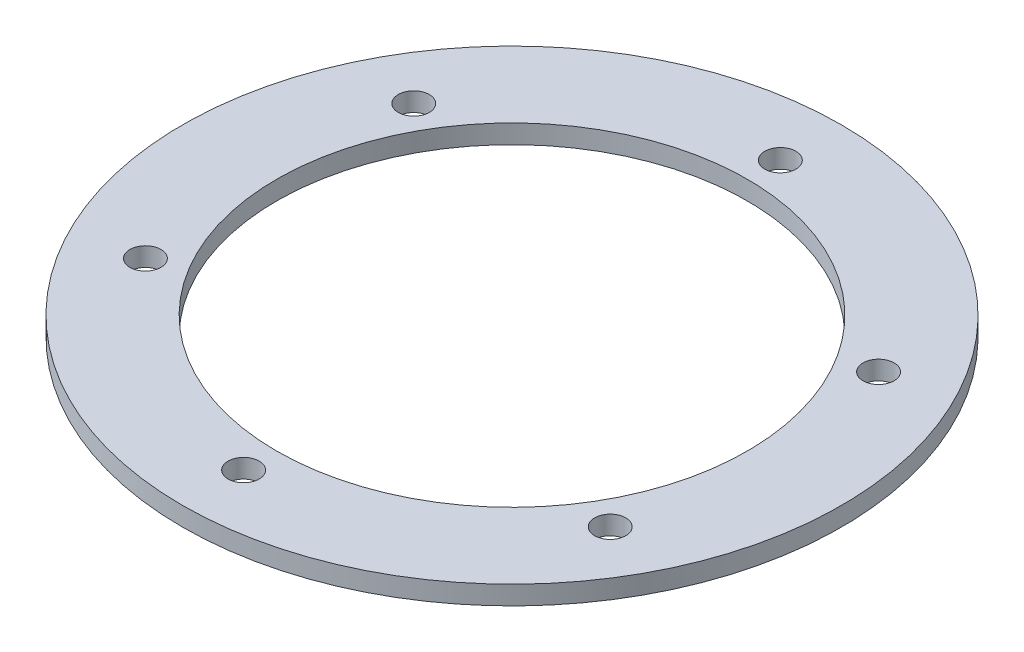
ISO-10303-21;
HEADER;
FILE_DESCRIPTION(('STEP AP214'),'2;1');
FILE_NAME('part.step','',(''),(''),'','','');
FILE_SCHEMA(('AUTOMOTIVE_DESIGN { 1 0 10303 214 1 1 1 1 }'));
ENDSEC;
DATA;
#1=APPLICATION_CONTEXT('core data for automotive mechanical design processes');
#2=APPLICATION_PROTOCOL_DEFINITION('international standard','automotive_design',2000,#1);
#3=PRODUCT_CONTEXT('',#1,'mechanical');
#4=PRODUCT('Part','Part','',(#3));
#5=PRODUCT_RELATED_PRODUCT_CATEGORY('part','',(#4));
#6=PRODUCT_DEFINITION_FORMATION('','',#4);
#7=PRODUCT_DEFINITION_CONTEXT('part definition',#1,'design');
#8=PRODUCT_DEFINITION('design','',#6,#7);
#9=PRODUCT_DEFINITION_SHAPE('','',#8);
#10=(LENGTH_UNIT() NAMED_UNIT(*) SI_UNIT(.MILLI.,.METRE.));
#11=(NAMED_UNIT(*) PLANE_ANGLE_UNIT() SI_UNIT($,.RADIAN.));
#12=(NAMED_UNIT(*) SI_UNIT($,.STERADIAN.) SOLID_ANGLE_UNIT());
#13=UNCERTAINTY_MEASURE_WITH_UNIT(LENGTH_MEASURE(1.E-05),#10,'distance_accuracy_value','');
#14=(GEOMETRIC_REPRESENTATION_CONTEXT(3) GLOBAL_UNCERTAINTY_ASSIGNED_CONTEXT((#13)) GLOBAL_UNIT_ASSIGNED_CONTEXT((#10,
#11,#12)) REPRESENTATION_CONTEXT('',''));
#15=CARTESIAN_POINT('',(0.,0.,0.));
#16=DIRECTION('',(0.,0.,1.));
#17=DIRECTION('',(1.,0.,0.));
#18=AXIS2_PLACEMENT_3D('',#15,#16,#17);
#19=CARTESIAN_POINT('',(0.,2.,0.));
#20=DIRECTION('',(0.,-1.,0.));
#21=DIRECTION('',(0.,0.,-1.));
#22=AXIS2_PLACEMENT_3D('',#19,#20,#21);
#23=CYLINDRICAL_SURFACE('',#22,35.);
#24=CARTESIAN_POINT('',(0.,2.,0.));
#25=DIRECTION('',(0.,1.,0.));
#26=DIRECTION('',(0.,0.,1.));
#27=AXIS2_PLACEMENT_3D('',#24,#25,#26);
#28=CIRCLE('',#27,35.);
#29=CARTESIAN_POINT('',(0.,2.,35.));
#30=VERTEX_POINT('',#29);
#31=EDGE_CURVE('E10',#30,#30,#28,.T.);
#32=ORIENTED_EDGE('',*,*,#31,.F.);
#33=EDGE_LOOP('',(#32));
#34=FACE_BOUND('',#33,.T.);
#35=CARTESIAN_POINT('',(0.,0.,0.));
#36=DIRECTION('',(0.,1.,0.));
#37=DIRECTION('',(0.,0.,1.));
#38=AXIS2_PLACEMENT_3D('',#35,#36,#37);
#39=CIRCLE('',#38,35.);
#40=CARTESIAN_POINT('',(0.,0.,35.));
#41=VERTEX_POINT('',#40);
#42=EDGE_CURVE('E40',#41,#41,#39,.T.);
#43=ORIENTED_EDGE('',*,*,#42,.T.);
#44=EDGE_LOOP('',(#43));
#45=FACE_BOUND('',#44,.T.);
#46=ADVANCED_FACE('F37',(#34,#45),#23,.T.);
#47=CARTESIAN_POINT('',(0.,2.,0.));
#48=DIRECTION('',(0.,1.,0.));
#49=DIRECTION('',(0.,0.,1.));
#50=AXIS2_PLACEMENT_3D('',#47,#48,#49);
#51=PLANE('',#50);
#52=CARTESIAN_POINT('',(24.6817240078563,2.,-14.2500000000003));
#53=DIRECTION('',(0.,1.,0.));
#54=DIRECTION('',(0.,0.,1.));
#55=AXIS2_PLACEMENT_3D('',#52,#53,#54);
#56=CIRCLE('',#55,1.65000000000001);
#57=CARTESIAN_POINT('',(24.6817240078563,2.,-12.6000000000003));
#58=VERTEX_POINT('',#57);
#59=EDGE_CURVE('E87',#58,#58,#56,.T.);
#60=ORIENTED_EDGE('',*,*,#59,.F.);
#61=EDGE_LOOP('',(#60));
#62=FACE_BOUND('',#61,.T.);
#63=CARTESIAN_POINT('',(24.6817240078566,2.,14.2499999999998));
#64=DIRECTION('',(0.,1.,0.));
#65=DIRECTION('',(0.,0.,1.));
#66=AXIS2_PLACEMENT_3D('',#63,#64,#65);
#67=CIRCLE('',#66,1.65000000000001);
#68=CARTESIAN_POINT('',(24.6817240078566,2.,15.8999999999998));
#69=VERTEX_POINT('',#68);
#70=EDGE_CURVE('E81',#69,#69,#67,.T.);
#71=ORIENTED_EDGE('',*,*,#70,.F.);
#72=EDGE_LOOP('',(#71));
#73=FACE_BOUND('',#72,.T.);
#74=CARTESIAN_POINT('',(0.,2.,28.5));
#75=DIRECTION('',(0.,1.,0.));
#76=DIRECTION('',(0.,0.,1.));
#77=AXIS2_PLACEMENT_3D('',#74,#75,#76);
#78=CIRCLE('',#77,1.65000000000001);
#79=CARTESIAN_POINT('',(0.,2.,30.15));
#80=VERTEX_POINT('',#79);
#81=EDGE_CURVE('E75',#80,#80,#78,.T.);
#82=ORIENTED_EDGE('',*,*,#81,.F.);
#83=EDGE_LOOP('',(#82));
#84=FACE_BOUND('',#83,.T.);
#85=CARTESIAN_POINT('',(-24.6817240078564,2.,14.2500000000001));
#86=DIRECTION('',(0.,1.,0.));
#87=DIRECTION('',(0.,0.,1.));
#88=AXIS2_PLACEMENT_3D('',#85,#86,#87);
#89=CIRCLE('',#88,1.65000000000001);
#90=CARTESIAN_POINT('',(-24.6817240078564,2.,15.9000000000001));
#91=VERTEX_POINT('',#90);
#92=EDGE_CURVE('E69',#91,#91,#89,.T.);
#93=ORIENTED_EDGE('',*,*,#92,.F.);
#94=EDGE_LOOP('',(#93));
#95=FACE_BOUND('',#94,.T.);
#96=CARTESIAN_POINT('',(-24.6817240078565,2.,-14.2499999999999));
#97=DIRECTION('',(0.,1.,0.));
#98=DIRECTION('',(0.,0.,1.));
#99=AXIS2_PLACEMENT_3D('',#96,#97,#98);
#100=CIRCLE('',#99,1.65000000000001);
#101=CARTESIAN_POINT('',(-24.6817240078565,2.,-12.5999999999999));
#102=VERTEX_POINT('',#101);
#103=EDGE_CURVE('E63',#102,#102,#100,.T.);
#104=ORIENTED_EDGE('',*,*,#103,.F.);
#105=EDGE_LOOP('',(#104));
#106=FACE_BOUND('',#105,.T.);
#107=CARTESIAN_POINT('',(0.,2.,-28.5));
#108=DIRECTION('',(0.,1.,0.));
#109=DIRECTION('',(0.,0.,1.));
#110=AXIS2_PLACEMENT_3D('',#107,#108,#109);
#111=CIRCLE('',#110,1.65000000000001);
#112=CARTESIAN_POINT('',(0.,2.,-26.85));
#113=VERTEX_POINT('',#112);
#114=EDGE_CURVE('E57',#113,#113,#111,.T.);
#115=ORIENTED_EDGE('',*,*,#114,.F.);
#116=EDGE_LOOP('',(#115));
#117=FACE_BOUND('',#116,.T.);
#118=CARTESIAN_POINT('',(0.,2.,0.));
#119=DIRECTION('',(0.,1.,0.));
#120=DIRECTION('',(0.,0.,1.));
#121=AXIS2_PLACEMENT_3D('',#118,#119,#120);
#122=CIRCLE('',#121,25.);
#123=CARTESIAN_POINT('',(0.,2.,25.));
#124=VERTEX_POINT('',#123);
#125=EDGE_CURVE('E49',#124,#124,#122,.T.);
#126=ORIENTED_EDGE('',*,*,#125,.F.);
#127=EDGE_LOOP('',(#126));
#128=FACE_BOUND('',#127,.T.);
#129=ORIENTED_EDGE('',*,*,#31,.T.);
#130=EDGE_LOOP('',(#129));
#131=FACE_BOUND('',#130,.T.);
#132=ADVANCED_FACE('F93',(#62,#73,#84,#95,#106,#117,#128,#131),#51,.T.);
#133=CARTESIAN_POINT('',(0.,0.,0.));
#134=DIRECTION('',(0.,1.,0.));
#135=DIRECTION('',(0.,0.,1.));
#136=AXIS2_PLACEMENT_3D('',#133,#134,#135);
#137=PLANE('',#136);
#138=CARTESIAN_POINT('',(24.6817240078563,0.,-14.2500000000003));
#139=DIRECTION('',(0.,1.,0.));
#140=DIRECTION('',(0.,0.,1.));
#141=AXIS2_PLACEMENT_3D('',#138,#139,#140);
#142=CIRCLE('',#141,1.65000000000001);
#143=CARTESIAN_POINT('',(24.6817240078563,0.,-12.6000000000003));
#144=VERTEX_POINT('',#143);
#145=EDGE_CURVE('E84',#144,#144,#142,.T.);
#146=ORIENTED_EDGE('',*,*,#145,.T.);
#147=EDGE_LOOP('',(#146));
#148=FACE_BOUND('',#147,.T.);
#149=CARTESIAN_POINT('',(24.6817240078566,0.,14.2499999999998));
#150=DIRECTION('',(0.,1.,0.));
#151=DIRECTION('',(0.,0.,1.));
#152=AXIS2_PLACEMENT_3D('',#149,#150,#151);
#153=CIRCLE('',#152,1.65000000000001);
#154=CARTESIAN_POINT('',(24.6817240078566,0.,15.8999999999998));
#155=VERTEX_POINT('',#154);
#156=EDGE_CURVE('E78',#155,#155,#153,.T.);
#157=ORIENTED_EDGE('',*,*,#156,.T.);
#158=EDGE_LOOP('',(#157));
#159=FACE_BOUND('',#158,.T.);
#160=CARTESIAN_POINT('',(0.,0.,28.5));
#161=DIRECTION('',(0.,1.,0.));
#162=DIRECTION('',(0.,0.,1.));
#163=AXIS2_PLACEMENT_3D('',#160,#161,#162);
#164=CIRCLE('',#163,1.65000000000001);
#165=CARTESIAN_POINT('',(0.,0.,30.15));
#166=VERTEX_POINT('',#165);
#167=EDGE_CURVE('E72',#166,#166,#164,.T.);
#168=ORIENTED_EDGE('',*,*,#167,.T.);
#169=EDGE_LOOP('',(#168));
#170=FACE_BOUND('',#169,.T.);
#171=CARTESIAN_POINT('',(-24.6817240078564,0.,14.2500000000001));
#172=DIRECTION('',(0.,1.,0.));
#173=DIRECTION('',(0.,0.,1.));
#174=AXIS2_PLACEMENT_3D('',#171,#172,#173);
#175=CIRCLE('',#174,1.65000000000001);
#176=CARTESIAN_POINT('',(-24.6817240078564,0.,15.9000000000001));
#177=VERTEX_POINT('',#176);
#178=EDGE_CURVE('E66',#177,#177,#175,.T.);
#179=ORIENTED_EDGE('',*,*,#178,.T.);
#180=EDGE_LOOP('',(#179));
#181=FACE_BOUND('',#180,.T.);
#182=CARTESIAN_POINT('',(-24.6817240078565,0.,-14.2499999999999));
#183=DIRECTION('',(0.,1.,0.));
#184=DIRECTION('',(0.,0.,1.));
#185=AXIS2_PLACEMENT_3D('',#182,#183,#184);
#186=CIRCLE('',#185,1.65000000000001);
#187=CARTESIAN_POINT('',(-24.6817240078565,0.,-12.5999999999999));
#188=VERTEX_POINT('',#187);
#189=EDGE_CURVE('E60',#188,#188,#186,.T.);
#190=ORIENTED_EDGE('',*,*,#189,.T.);
#191=EDGE_LOOP('',(#190));
#192=FACE_BOUND('',#191,.T.);
#193=CARTESIAN_POINT('',(0.,0.,-28.5));
#194=DIRECTION('',(0.,1.,0.));
#195=DIRECTION('',(0.,0.,1.));
#196=AXIS2_PLACEMENT_3D('',#193,#194,#195);
#197=CIRCLE('',#196,1.65000000000001);
#198=CARTESIAN_POINT('',(0.,0.,-26.85));
#199=VERTEX_POINT('',#198);
#200=EDGE_CURVE('E52',#199,#199,#197,.T.);
#201=ORIENTED_EDGE('',*,*,#200,.T.);
#202=EDGE_LOOP('',(#201));
#203=FACE_BOUND('',#202,.T.);
#204=CARTESIAN_POINT('',(0.,0.,0.));
#205=DIRECTION('',(0.,1.,0.));
#206=DIRECTION('',(0.,0.,1.));
#207=AXIS2_PLACEMENT_3D('',#204,#205,#206);
#208=CIRCLE('',#207,25.);
#209=CARTESIAN_POINT('',(0.,0.,25.));
#210=VERTEX_POINT('',#209);
#211=EDGE_CURVE('E47',#210,#210,#208,.T.);
#212=ORIENTED_EDGE('',*,*,#211,.T.);
#213=EDGE_LOOP('',(#212));
#214=FACE_BOUND('',#213,.T.);
#215=ORIENTED_EDGE('',*,*,#42,.F.);
#216=EDGE_LOOP('',(#215));
#217=FACE_BOUND('',#216,.T.);
#218=ADVANCED_FACE('F96',(#148,#159,#170,#181,#192,#203,#214,#217),#137,.F.);
#219=CARTESIAN_POINT('',(0.,0.,0.));
#220=DIRECTION('',(0.,1.,0.));
#221=DIRECTION('',(0.,0.,1.));
#222=AXIS2_PLACEMENT_3D('',#219,#220,#221);
#223=CYLINDRICAL_SURFACE('',#222,25.);
#224=ORIENTED_EDGE('',*,*,#211,.F.);
#225=EDGE_LOOP('',(#224));
#226=FACE_BOUND('',#225,.T.);
#227=ORIENTED_EDGE('',*,*,#125,.T.);
#228=EDGE_LOOP('',(#227));
#229=FACE_BOUND('',#228,.T.);
#230=ADVANCED_FACE('F110',(#226,#229),#223,.F.);
#231=CARTESIAN_POINT('',(0.,2.,-28.5));
#232=DIRECTION('',(0.,1.,0.));
#233=DIRECTION('',(0.,0.,1.));
#234=AXIS2_PLACEMENT_3D('',#231,#232,#233);
#235=CYLINDRICAL_SURFACE('',#234,1.65000000000001);
#236=ORIENTED_EDGE('',*,*,#200,.F.);
#237=EDGE_LOOP('',(#236));
#238=FACE_BOUND('',#237,.T.);
#239=ORIENTED_EDGE('',*,*,#114,.T.);
#240=EDGE_LOOP('',(#239));
#241=FACE_BOUND('',#240,.T.);
#242=ADVANCED_FACE('F112',(#238,#241),#235,.F.);
#243=CARTESIAN_POINT('',(-24.6817240078565,2.,-14.2499999999999));
#244=DIRECTION('',(0.,1.,0.));
#245=DIRECTION('',(0.,0.,1.));
#246=AXIS2_PLACEMENT_3D('',#243,#244,#245);
#247=CYLINDRICAL_SURFACE('',#246,1.65000000000001);
#248=ORIENTED_EDGE('',*,*,#189,.F.);
#249=EDGE_LOOP('',(#248));
#250=FACE_BOUND('',#249,.T.);
#251=ORIENTED_EDGE('',*,*,#103,.T.);
#252=EDGE_LOOP('',(#251));
#253=FACE_BOUND('',#252,.T.);
#254=ADVANCED_FACE('F119',(#250,#253),#247,.F.);
#255=CARTESIAN_POINT('',(-24.6817240078564,2.,14.2500000000001));
#256=DIRECTION('',(0.,1.,0.));
#257=DIRECTION('',(0.,0.,1.));
#258=AXIS2_PLACEMENT_3D('',#255,#256,#257);
#259=CYLINDRICAL_SURFACE('',#258,1.65000000000001);
#260=ORIENTED_EDGE('',*,*,#178,.F.);
#261=EDGE_LOOP('',(#260));
#262=FACE_BOUND('',#261,.T.);
#263=ORIENTED_EDGE('',*,*,#92,.T.);
#264=EDGE_LOOP('',(#263));
#265=FACE_BOUND('',#264,.T.);
#266=ADVANCED_FACE('F163',(#262,#265),#259,.F.);
#267=CARTESIAN_POINT('',(0.,2.,28.5));
#268=DIRECTION('',(0.,1.,0.));
#269=DIRECTION('',(0.,0.,1.));
#270=AXIS2_PLACEMENT_3D('',#267,#268,#269);
#271=CYLINDRICAL_SURFACE('',#270,1.65000000000001);
#272=ORIENTED_EDGE('',*,*,#167,.F.);
#273=EDGE_LOOP('',(#272));
#274=FACE_BOUND('',#273,.T.);
#275=ORIENTED_EDGE('',*,*,#81,.T.);
#276=EDGE_LOOP('',(#275));
#277=FACE_BOUND('',#276,.T.);
#278=ADVANCED_FACE('F173',(#274,#277),#271,.F.);
#279=CARTESIAN_POINT('',(24.6817240078566,2.,14.2499999999998));
#280=DIRECTION('',(0.,1.,0.));
#281=DIRECTION('',(0.,0.,1.));
#282=AXIS2_PLACEMENT_3D('',#279,#280,#281);
#283=CYLINDRICAL_SURFACE('',#282,1.65000000000001);
#284=ORIENTED_EDGE('',*,*,#156,.F.);
#285=EDGE_LOOP('',(#284));
#286=FACE_BOUND('',#285,.T.);
#287=ORIENTED_EDGE('',*,*,#70,.T.);
#288=EDGE_LOOP('',(#287));
#289=FACE_BOUND('',#288,.T.);
#290=ADVANCED_FACE('F183',(#286,#289),#283,.F.);
#291=CARTESIAN_POINT('',(24.6817240078563,2.,-14.2500000000003));
#292=DIRECTION('',(0.,1.,0.));
#293=DIRECTION('',(0.,0.,1.));
#294=AXIS2_PLACEMENT_3D('',#291,#292,#293);
#295=CYLINDRICAL_SURFACE('',#294,1.65000000000001);
#296=ORIENTED_EDGE('',*,*,#145,.F.);
#297=EDGE_LOOP('',(#296));
#298=FACE_BOUND('',#297,.T.);
#299=ORIENTED_EDGE('',*,*,#59,.T.);
#300=EDGE_LOOP('',(#299));
#301=FACE_BOUND('',#300,.T.);
#302=ADVANCED_FACE('F91',(#298,#301),#295,.F.);
#303=CLOSED_SHELL('',(#46,#132,#218,#230,#242,#254,#266,#278,#290,#302));
#304=MANIFOLD_SOLID_BREP('B2',#303);
#305=ADVANCED_BREP_SHAPE_REPRESENTATION('',(#18,#304),#14);
#306=SHAPE_DEFINITION_REPRESENTATION(#9,#305);
ENDSEC;
END-ISO-10303-21;
